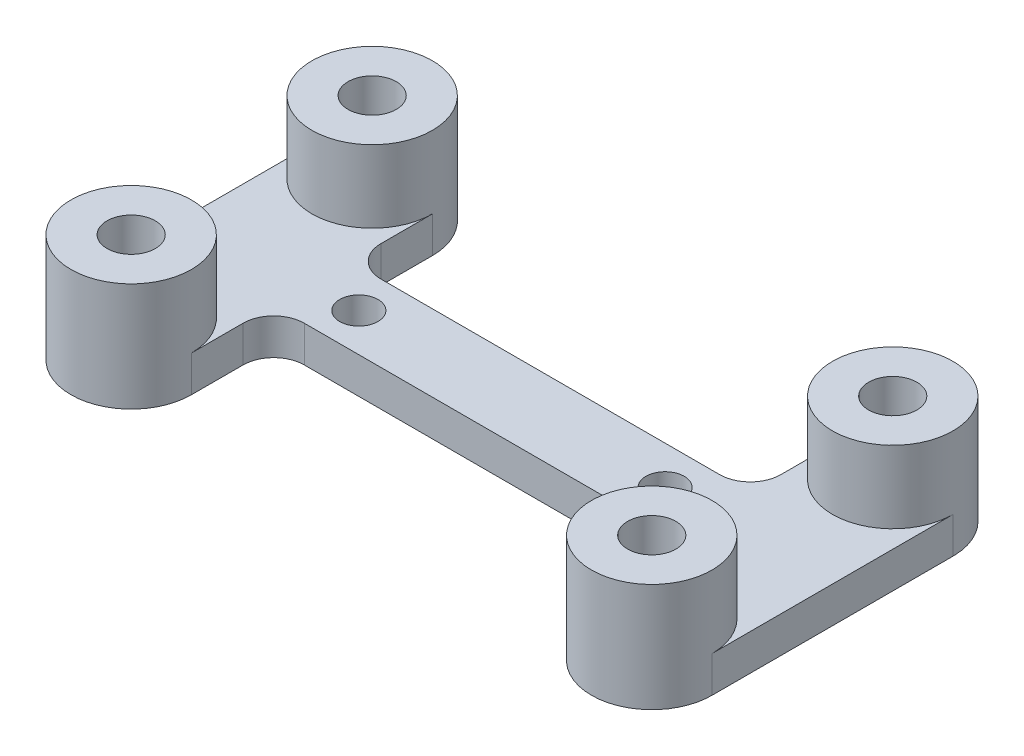
ISO-10303-21;
HEADER;
FILE_DESCRIPTION(('STEP AP214'),'2;1');
FILE_NAME('part.step','',(''),(''),'','','');
FILE_SCHEMA(('AUTOMOTIVE_DESIGN { 1 0 10303 214 1 1 1 1 }'));
ENDSEC;
DATA;
#1=APPLICATION_CONTEXT('core data for automotive mechanical design processes');
#2=APPLICATION_PROTOCOL_DEFINITION('international standard','automotive_design',2000,#1);
#3=PRODUCT_CONTEXT('',#1,'mechanical');
#4=PRODUCT('Part','Part','',(#3));
#5=PRODUCT_RELATED_PRODUCT_CATEGORY('part','',(#4));
#6=PRODUCT_DEFINITION_FORMATION('','',#4);
#7=PRODUCT_DEFINITION_CONTEXT('part definition',#1,'design');
#8=PRODUCT_DEFINITION('design','',#6,#7);
#9=PRODUCT_DEFINITION_SHAPE('','',#8);
#10=(LENGTH_UNIT() NAMED_UNIT(*) SI_UNIT(.MILLI.,.METRE.));
#11=(NAMED_UNIT(*) PLANE_ANGLE_UNIT() SI_UNIT($,.RADIAN.));
#12=(NAMED_UNIT(*) SI_UNIT($,.STERADIAN.) SOLID_ANGLE_UNIT());
#13=UNCERTAINTY_MEASURE_WITH_UNIT(LENGTH_MEASURE(1.E-05),#10,'distance_accuracy_value','');
#14=(GEOMETRIC_REPRESENTATION_CONTEXT(3) GLOBAL_UNCERTAINTY_ASSIGNED_CONTEXT((#13)) GLOBAL_UNIT_ASSIGNED_CONTEXT((#10,
#11,#12)) REPRESENTATION_CONTEXT('',''));
#15=CARTESIAN_POINT('',(0.,0.,0.));
#16=DIRECTION('',(0.,0.,1.));
#17=DIRECTION('',(1.,0.,0.));
#18=AXIS2_PLACEMENT_3D('',#15,#16,#17);
#19=CARTESIAN_POINT('',(21.59,9.,9.9949));
#20=DIRECTION('',(0.,1.,0.));
#21=DIRECTION('',(0.,0.,1.));
#22=AXIS2_PLACEMENT_3D('',#19,#20,#21);
#23=PLANE('',#22);
#24=CARTESIAN_POINT('',(21.59,9.,9.9949));
#25=DIRECTION('',(0.,1.,0.));
#26=DIRECTION('',(0.,0.,1.));
#27=AXIS2_PLACEMENT_3D('',#24,#25,#26);
#28=CIRCLE('',#27,5.);
#29=CARTESIAN_POINT('',(21.59,9.,14.9949));
#30=VERTEX_POINT('',#29);
#31=EDGE_CURVE('E65',#30,#30,#28,.T.);
#32=ORIENTED_EDGE('',*,*,#31,.T.);
#33=EDGE_LOOP('',(#32));
#34=FACE_BOUND('',#33,.T.);
#35=CARTESIAN_POINT('',(21.59,9.,9.9949));
#36=DIRECTION('',(0.,1.,0.));
#37=DIRECTION('',(0.,0.,1.));
#38=AXIS2_PLACEMENT_3D('',#35,#36,#37);
#39=CIRCLE('',#38,2.);
#40=CARTESIAN_POINT('',(21.59,9.,11.9949));
#41=VERTEX_POINT('',#40);
#42=EDGE_CURVE('E56',#41,#41,#39,.T.);
#43=ORIENTED_EDGE('',*,*,#42,.F.);
#44=EDGE_LOOP('',(#43));
#45=FACE_BOUND('',#44,.T.);
#46=ADVANCED_FACE('F52',(#34,#45),#23,.T.);
#47=CARTESIAN_POINT('',(21.59,0.,9.9949));
#48=DIRECTION('',(0.,1.,0.));
#49=DIRECTION('',(0.,0.,1.));
#50=AXIS2_PLACEMENT_3D('',#47,#48,#49);
#51=PLANE('',#50);
#52=CARTESIAN_POINT('',(21.59,0.,9.9949));
#53=DIRECTION('',(0.,1.,0.));
#54=DIRECTION('',(0.,0.,1.));
#55=AXIS2_PLACEMENT_3D('',#52,#53,#54);
#56=CIRCLE('',#55,5.);
#57=CARTESIAN_POINT('',(21.59,0.,14.9949));
#58=VERTEX_POINT('',#57);
#59=EDGE_CURVE('E63',#58,#58,#56,.T.);
#60=ORIENTED_EDGE('',*,*,#59,.F.);
#61=EDGE_LOOP('',(#60));
#62=FACE_BOUND('',#61,.T.);
#63=CARTESIAN_POINT('',(21.59,0.,9.9949));
#64=DIRECTION('',(0.,1.,0.));
#65=DIRECTION('',(0.,0.,1.));
#66=AXIS2_PLACEMENT_3D('',#63,#64,#65);
#67=CIRCLE('',#66,2.);
#68=CARTESIAN_POINT('',(21.59,0.,11.9949));
#69=VERTEX_POINT('',#68);
#70=EDGE_CURVE('E11',#69,#69,#67,.T.);
#71=ORIENTED_EDGE('',*,*,#70,.T.);
#72=EDGE_LOOP('',(#71));
#73=FACE_BOUND('',#72,.T.);
#74=ADVANCED_FACE('F73',(#62,#73),#51,.F.);
#75=CARTESIAN_POINT('',(21.59,9.,9.9949));
#76=DIRECTION('',(0.,-1.,0.));
#77=DIRECTION('',(0.,0.,-1.));
#78=AXIS2_PLACEMENT_3D('',#75,#76,#77);
#79=CYLINDRICAL_SURFACE('',#78,5.);
#80=ORIENTED_EDGE('',*,*,#31,.F.);
#81=EDGE_LOOP('',(#80));
#82=FACE_BOUND('',#81,.T.);
#83=ORIENTED_EDGE('',*,*,#59,.T.);
#84=EDGE_LOOP('',(#83));
#85=FACE_BOUND('',#84,.T.);
#86=ADVANCED_FACE('F71',(#82,#85),#79,.T.);
#87=CARTESIAN_POINT('',(21.59,9.,9.9949));
#88=DIRECTION('',(0.,-1.,0.));
#89=DIRECTION('',(0.,0.,-1.));
#90=AXIS2_PLACEMENT_3D('',#87,#88,#89);
#91=CYLINDRICAL_SURFACE('',#90,2.);
#92=ORIENTED_EDGE('',*,*,#42,.T.);
#93=EDGE_LOOP('',(#92));
#94=FACE_BOUND('',#93,.T.);
#95=ORIENTED_EDGE('',*,*,#70,.F.);
#96=EDGE_LOOP('',(#95));
#97=FACE_BOUND('',#96,.T.);
#98=ADVANCED_FACE('F54',(#94,#97),#91,.F.);
#99=CLOSED_SHELL('',(#46,#74,#86,#98));
#100=MANIFOLD_SOLID_BREP('B2',#99);
#101=CARTESIAN_POINT('',(21.59,9.,-9.9949));
#102=DIRECTION('',(0.,1.,0.));
#103=DIRECTION('',(0.,0.,1.));
#104=AXIS2_PLACEMENT_3D('',#101,#102,#103);
#105=PLANE('',#104);
#106=CARTESIAN_POINT('',(21.59,9.,-9.9949));
#107=DIRECTION('',(0.,1.,0.));
#108=DIRECTION('',(0.,0.,1.));
#109=AXIS2_PLACEMENT_3D('',#106,#107,#108);
#110=CIRCLE('',#109,5.);
#111=CARTESIAN_POINT('',(21.59,9.,-4.9949));
#112=VERTEX_POINT('',#111);
#113=EDGE_CURVE('E144',#112,#112,#110,.T.);
#114=ORIENTED_EDGE('',*,*,#113,.T.);
#115=EDGE_LOOP('',(#114));
#116=FACE_BOUND('',#115,.T.);
#117=CARTESIAN_POINT('',(21.59,9.,-9.9949));
#118=DIRECTION('',(0.,1.,0.));
#119=DIRECTION('',(0.,0.,1.));
#120=AXIS2_PLACEMENT_3D('',#117,#118,#119);
#121=CIRCLE('',#120,2.);
#122=CARTESIAN_POINT('',(21.59,9.,-7.9949));
#123=VERTEX_POINT('',#122);
#124=EDGE_CURVE('E135',#123,#123,#121,.T.);
#125=ORIENTED_EDGE('',*,*,#124,.F.);
#126=EDGE_LOOP('',(#125));
#127=FACE_BOUND('',#126,.T.);
#128=ADVANCED_FACE('F131',(#116,#127),#105,.T.);
#129=CARTESIAN_POINT('',(21.59,0.,-9.9949));
#130=DIRECTION('',(0.,1.,0.));
#131=DIRECTION('',(0.,0.,1.));
#132=AXIS2_PLACEMENT_3D('',#129,#130,#131);
#133=PLANE('',#132);
#134=CARTESIAN_POINT('',(21.59,0.,-9.9949));
#135=DIRECTION('',(0.,1.,0.));
#136=DIRECTION('',(0.,0.,1.));
#137=AXIS2_PLACEMENT_3D('',#134,#135,#136);
#138=CIRCLE('',#137,5.);
#139=CARTESIAN_POINT('',(21.59,0.,-4.9949));
#140=VERTEX_POINT('',#139);
#141=EDGE_CURVE('E142',#140,#140,#138,.T.);
#142=ORIENTED_EDGE('',*,*,#141,.F.);
#143=EDGE_LOOP('',(#142));
#144=FACE_BOUND('',#143,.T.);
#145=CARTESIAN_POINT('',(21.59,0.,-9.9949));
#146=DIRECTION('',(0.,1.,0.));
#147=DIRECTION('',(0.,0.,1.));
#148=AXIS2_PLACEMENT_3D('',#145,#146,#147);
#149=CIRCLE('',#148,2.);
#150=CARTESIAN_POINT('',(21.59,0.,-7.9949));
#151=VERTEX_POINT('',#150);
#152=EDGE_CURVE('E51',#151,#151,#149,.T.);
#153=ORIENTED_EDGE('',*,*,#152,.T.);
#154=EDGE_LOOP('',(#153));
#155=FACE_BOUND('',#154,.T.);
#156=ADVANCED_FACE('F152',(#144,#155),#133,.F.);
#157=CARTESIAN_POINT('',(21.59,9.,-9.9949));
#158=DIRECTION('',(0.,-1.,0.));
#159=DIRECTION('',(0.,0.,-1.));
#160=AXIS2_PLACEMENT_3D('',#157,#158,#159);
#161=CYLINDRICAL_SURFACE('',#160,5.);
#162=ORIENTED_EDGE('',*,*,#113,.F.);
#163=EDGE_LOOP('',(#162));
#164=FACE_BOUND('',#163,.T.);
#165=ORIENTED_EDGE('',*,*,#141,.T.);
#166=EDGE_LOOP('',(#165));
#167=FACE_BOUND('',#166,.T.);
#168=ADVANCED_FACE('F150',(#164,#167),#161,.T.);
#169=CARTESIAN_POINT('',(21.59,9.,-9.9949));
#170=DIRECTION('',(0.,-1.,0.));
#171=DIRECTION('',(0.,0.,-1.));
#172=AXIS2_PLACEMENT_3D('',#169,#170,#171);
#173=CYLINDRICAL_SURFACE('',#172,2.);
#174=ORIENTED_EDGE('',*,*,#124,.T.);
#175=EDGE_LOOP('',(#174));
#176=FACE_BOUND('',#175,.T.);
#177=ORIENTED_EDGE('',*,*,#152,.F.);
#178=EDGE_LOOP('',(#177));
#179=FACE_BOUND('',#178,.T.);
#180=ADVANCED_FACE('F133',(#176,#179),#173,.F.);
#181=CLOSED_SHELL('',(#128,#156,#168,#180));
#182=MANIFOLD_SOLID_BREP('B6',#181);
#183=CARTESIAN_POINT('',(0.,3.,0.));
#184=DIRECTION('',(0.,1.,0.));
#185=DIRECTION('',(0.,0.,1.));
#186=AXIS2_PLACEMENT_3D('',#183,#184,#185);
#187=PLANE('',#186);
#188=CARTESIAN_POINT('',(-12.7,3.,0.));
#189=DIRECTION('',(0.,1.,0.));
#190=DIRECTION('',(0.,0.,1.));
#191=AXIS2_PLACEMENT_3D('',#188,#189,#190);
#192=CIRCLE('',#191,1.5875);
#193=CARTESIAN_POINT('',(-12.7,3.,1.5875));
#194=VERTEX_POINT('',#193);
#195=EDGE_CURVE('E605',#194,#194,#192,.T.);
#196=ORIENTED_EDGE('',*,*,#195,.F.);
#197=EDGE_LOOP('',(#196));
#198=FACE_BOUND('',#197,.T.);
#199=CARTESIAN_POINT('',(12.7,3.,0.));
#200=DIRECTION('',(0.,1.,0.));
#201=DIRECTION('',(0.,0.,1.));
#202=AXIS2_PLACEMENT_3D('',#199,#200,#201);
#203=CIRCLE('',#202,1.5875);
#204=CARTESIAN_POINT('',(12.7,3.,1.5875));
#205=VERTEX_POINT('',#204);
#206=EDGE_CURVE('E609',#205,#205,#203,.T.);
#207=ORIENTED_EDGE('',*,*,#206,.F.);
#208=EDGE_LOOP('',(#207));
#209=FACE_BOUND('',#208,.T.);
#210=DIRECTION('',(0.,0.,-1.));
#211=VECTOR('',#210,1.);
#212=CARTESIAN_POINT('',(-26.59,3.,0.));
#213=LINE('',#212,#211);
#214=CARTESIAN_POINT('',(-26.59,3.,9.9949));
#215=VERTEX_POINT('',#214);
#216=CARTESIAN_POINT('',(-26.59,3.,-9.9949));
#217=VERTEX_POINT('',#216);
#218=EDGE_CURVE('E460',#215,#217,#213,.T.);
#219=ORIENTED_EDGE('',*,*,#218,.F.);
#220=CARTESIAN_POINT('',(-21.59,3.,9.9949));
#221=DIRECTION('',(0.,1.,0.));
#222=DIRECTION('',(0.,0.,1.));
#223=AXIS2_PLACEMENT_3D('',#220,#221,#222);
#224=CIRCLE('',#223,5.);
#225=CARTESIAN_POINT('',(-16.59,3.,9.9949));
#226=VERTEX_POINT('',#225);
#227=EDGE_CURVE('E442',#215,#226,#224,.F.);
#228=ORIENTED_EDGE('',*,*,#227,.T.);
#229=DIRECTION('',(0.,0.,-1.));
#230=VECTOR('',#229,1.);
#231=CARTESIAN_POINT('',(-16.59,3.,0.));
#232=LINE('',#231,#230);
#233=CARTESIAN_POINT('',(-16.59,3.,5.715));
#234=VERTEX_POINT('',#233);
#235=EDGE_CURVE('E447',#226,#234,#232,.T.);
#236=ORIENTED_EDGE('',*,*,#235,.T.);
#237=CARTESIAN_POINT('',(-14.05,3.,5.715));
#238=DIRECTION('',(0.,1.,0.));
#239=DIRECTION('',(0.,0.,1.));
#240=AXIS2_PLACEMENT_3D('',#237,#238,#239);
#241=CIRCLE('',#240,2.54);
#242=CARTESIAN_POINT('',(-14.05,3.,3.175));
#243=VERTEX_POINT('',#242);
#244=EDGE_CURVE('E129',#234,#243,#241,.F.);
#245=ORIENTED_EDGE('',*,*,#244,.T.);
#246=DIRECTION('',(-1.,0.,0.));
#247=VECTOR('',#246,1.);
#248=CARTESIAN_POINT('',(0.,3.,3.175));
#249=LINE('',#248,#247);
#250=CARTESIAN_POINT('',(14.05,3.,3.175));
#251=VERTEX_POINT('',#250);
#252=EDGE_CURVE('E450',#251,#243,#249,.T.);
#253=ORIENTED_EDGE('',*,*,#252,.F.);
#254=CARTESIAN_POINT('',(14.05,3.,5.715));
#255=DIRECTION('',(0.,1.,0.));
#256=DIRECTION('',(0.,0.,1.));
#257=AXIS2_PLACEMENT_3D('',#254,#255,#256);
#258=CIRCLE('',#257,2.54);
#259=CARTESIAN_POINT('',(16.59,3.,5.715));
#260=VERTEX_POINT('',#259);
#261=EDGE_CURVE('E544',#251,#260,#258,.F.);
#262=ORIENTED_EDGE('',*,*,#261,.T.);
#263=DIRECTION('',(0.,0.,-1.));
#264=VECTOR('',#263,1.);
#265=CARTESIAN_POINT('',(16.59,3.,0.));
#266=LINE('',#265,#264);
#267=CARTESIAN_POINT('',(16.59,3.,9.9949));
#268=VERTEX_POINT('',#267);
#269=EDGE_CURVE('E374',#268,#260,#266,.T.);
#270=ORIENTED_EDGE('',*,*,#269,.F.);
#271=DIRECTION('',(-1.,0.,0.));
#272=VECTOR('',#271,1.);
#273=CARTESIAN_POINT('',(0.,3.,9.9949));
#274=LINE('',#273,#272);
#275=CARTESIAN_POINT('',(19.59,3.,9.9949));
#276=VERTEX_POINT('',#275);
#277=EDGE_CURVE('E347',#276,#268,#274,.T.);
#278=ORIENTED_EDGE('',*,*,#277,.F.);
#279=CARTESIAN_POINT('',(21.59,3.,9.9949));
#280=DIRECTION('',(0.,-1.,0.));
#281=DIRECTION('',(0.,0.,1.));
#282=AXIS2_PLACEMENT_3D('',#279,#280,#281);
#283=CIRCLE('',#282,2.00000000000001);
#284=CARTESIAN_POINT('',(23.59,3.,9.9949));
#285=VERTEX_POINT('',#284);
#286=EDGE_CURVE('E340',#276,#285,#283,.T.);
#287=ORIENTED_EDGE('',*,*,#286,.T.);
#288=CARTESIAN_POINT('',(26.59,3.,9.9949));
#289=VERTEX_POINT('',#288);
#290=EDGE_CURVE('E344',#289,#285,#274,.T.);
#291=ORIENTED_EDGE('',*,*,#290,.F.);
#292=DIRECTION('',(0.,0.,-1.));
#293=VECTOR('',#292,1.);
#294=CARTESIAN_POINT('',(26.59,3.,0.));
#295=LINE('',#294,#293);
#296=CARTESIAN_POINT('',(26.59,3.,-9.9949));
#297=VERTEX_POINT('',#296);
#298=EDGE_CURVE('E367',#289,#297,#295,.T.);
#299=ORIENTED_EDGE('',*,*,#298,.T.);
#300=DIRECTION('',(-1.,0.,0.));
#301=VECTOR('',#300,1.);
#302=CARTESIAN_POINT('',(0.,3.,-9.9949));
#303=LINE('',#302,#301);
#304=CARTESIAN_POINT('',(23.59,3.,-9.9949));
#305=VERTEX_POINT('',#304);
#306=EDGE_CURVE('E370',#297,#305,#303,.T.);
#307=ORIENTED_EDGE('',*,*,#306,.T.);
#308=CARTESIAN_POINT('',(21.59,3.,-9.9949));
#309=DIRECTION('',(0.,-1.,0.));
#310=DIRECTION('',(0.,0.,1.));
#311=AXIS2_PLACEMENT_3D('',#308,#309,#310);
#312=CIRCLE('',#311,2.00000000000001);
#313=CARTESIAN_POINT('',(19.59,3.,-9.9949));
#314=VERTEX_POINT('',#313);
#315=EDGE_CURVE('E390',#305,#314,#312,.T.);
#316=ORIENTED_EDGE('',*,*,#315,.T.);
#317=CARTESIAN_POINT('',(16.59,3.,-9.9949));
#318=VERTEX_POINT('',#317);
#319=EDGE_CURVE('E387',#314,#318,#303,.T.);
#320=ORIENTED_EDGE('',*,*,#319,.T.);
#321=CARTESIAN_POINT('',(16.59,3.,-5.715));
#322=VERTEX_POINT('',#321);
#323=EDGE_CURVE('E381',#322,#318,#266,.T.);
#324=ORIENTED_EDGE('',*,*,#323,.F.);
#325=CARTESIAN_POINT('',(14.05,3.,-5.715));
#326=DIRECTION('',(0.,1.,0.));
#327=DIRECTION('',(0.,0.,1.));
#328=AXIS2_PLACEMENT_3D('',#325,#326,#327);
#329=CIRCLE('',#328,2.54);
#330=CARTESIAN_POINT('',(14.05,3.,-3.175));
#331=VERTEX_POINT('',#330);
#332=EDGE_CURVE('E550',#322,#331,#329,.F.);
#333=ORIENTED_EDGE('',*,*,#332,.T.);
#334=DIRECTION('',(-1.,0.,0.));
#335=VECTOR('',#334,1.);
#336=CARTESIAN_POINT('',(0.,3.,-3.175));
#337=LINE('',#336,#335);
#338=CARTESIAN_POINT('',(-14.05,3.,-3.175));
#339=VERTEX_POINT('',#338);
#340=EDGE_CURVE('E456',#331,#339,#337,.T.);
#341=ORIENTED_EDGE('',*,*,#340,.T.);
#342=CARTESIAN_POINT('',(-14.05,3.,-5.715));
#343=DIRECTION('',(0.,1.,0.));
#344=DIRECTION('',(0.,0.,1.));
#345=AXIS2_PLACEMENT_3D('',#342,#343,#344);
#346=CIRCLE('',#345,2.54);
#347=CARTESIAN_POINT('',(-16.59,3.,-5.715));
#348=VERTEX_POINT('',#347);
#349=EDGE_CURVE('E556',#339,#348,#346,.F.);
#350=ORIENTED_EDGE('',*,*,#349,.T.);
#351=CARTESIAN_POINT('',(-16.59,3.,-9.9949));
#352=VERTEX_POINT('',#351);
#353=EDGE_CURVE('E452',#348,#352,#232,.T.);
#354=ORIENTED_EDGE('',*,*,#353,.T.);
#355=CARTESIAN_POINT('',(-21.59,3.,-9.9949));
#356=DIRECTION('',(0.,1.,0.));
#357=DIRECTION('',(0.,0.,1.));
#358=AXIS2_PLACEMENT_3D('',#355,#356,#357);
#359=CIRCLE('',#358,5.);
#360=EDGE_CURVE('E496',#217,#352,#359,.T.);
#361=ORIENTED_EDGE('',*,*,#360,.F.);
#362=EDGE_LOOP('',(#219,#228,#236,#245,#253,#262,#270,#278,#287,#291,#299,#307,#316,#320,#324,
#333,#341,#350,#354,#361));
#363=FACE_BOUND('',#362,.T.);
#364=ADVANCED_FACE('F201',(#198,#209,#363),#187,.T.);
#365=CARTESIAN_POINT('',(-21.59,9.,-9.9949));
#366=DIRECTION('',(0.,1.,0.));
#367=DIRECTION('',(0.,0.,1.));
#368=AXIS2_PLACEMENT_3D('',#365,#366,#367);
#369=PLANE('',#368);
#370=CARTESIAN_POINT('',(-21.59,9.,-9.9949));
#371=DIRECTION('',(0.,1.,0.));
#372=DIRECTION('',(0.,0.,1.));
#373=AXIS2_PLACEMENT_3D('',#370,#371,#372);
#374=CIRCLE('',#373,5.);
#375=CARTESIAN_POINT('',(-21.59,9.,-4.9949));
#376=VERTEX_POINT('',#375);
#377=EDGE_CURVE('E509',#376,#376,#374,.T.);
#378=ORIENTED_EDGE('',*,*,#377,.T.);
#379=EDGE_LOOP('',(#378));
#380=FACE_BOUND('',#379,.T.);
#381=CARTESIAN_POINT('',(-21.59,9.,-9.9949));
#382=DIRECTION('',(0.,1.,0.));
#383=DIRECTION('',(0.,0.,1.));
#384=AXIS2_PLACEMENT_3D('',#381,#382,#383);
#385=CIRCLE('',#384,2.);
#386=CARTESIAN_POINT('',(-21.59,9.,-7.9949));
#387=VERTEX_POINT('',#386);
#388=EDGE_CURVE('E501',#387,#387,#385,.T.);
#389=ORIENTED_EDGE('',*,*,#388,.F.);
#390=EDGE_LOOP('',(#389));
#391=FACE_BOUND('',#390,.T.);
#392=ADVANCED_FACE('F629',(#380,#391),#369,.T.);
#393=CARTESIAN_POINT('',(-21.59,0.,-9.9949));
#394=DIRECTION('',(0.,1.,0.));
#395=DIRECTION('',(0.,0.,1.));
#396=AXIS2_PLACEMENT_3D('',#393,#394,#395);
#397=PLANE('',#396);
#398=CARTESIAN_POINT('',(-12.7,0.,0.));
#399=DIRECTION('',(0.,1.,0.));
#400=DIRECTION('',(0.,0.,1.));
#401=AXIS2_PLACEMENT_3D('',#398,#399,#400);
#402=CIRCLE('',#401,1.5875);
#403=CARTESIAN_POINT('',(-12.7,0.,1.5875));
#404=VERTEX_POINT('',#403);
#405=EDGE_CURVE('E395',#404,#404,#402,.T.);
#406=ORIENTED_EDGE('',*,*,#405,.T.);
#407=EDGE_LOOP('',(#406));
#408=FACE_BOUND('',#407,.T.);
#409=CARTESIAN_POINT('',(12.7,0.,0.));
#410=DIRECTION('',(0.,1.,0.));
#411=DIRECTION('',(0.,0.,1.));
#412=AXIS2_PLACEMENT_3D('',#409,#410,#411);
#413=CIRCLE('',#412,1.5875);
#414=CARTESIAN_POINT('',(12.7,0.,1.5875));
#415=VERTEX_POINT('',#414);
#416=EDGE_CURVE('E613',#415,#415,#413,.T.);
#417=ORIENTED_EDGE('',*,*,#416,.T.);
#418=EDGE_LOOP('',(#417));
#419=FACE_BOUND('',#418,.T.);
#420=CARTESIAN_POINT('',(-21.59,0.,9.9949));
#421=DIRECTION('',(0.,1.,0.));
#422=DIRECTION('',(0.,0.,1.));
#423=AXIS2_PLACEMENT_3D('',#420,#421,#422);
#424=CIRCLE('',#423,5.);
#425=CARTESIAN_POINT('',(-26.59,0.,9.9949));
#426=VERTEX_POINT('',#425);
#427=CARTESIAN_POINT('',(-16.59,0.,9.9949));
#428=VERTEX_POINT('',#427);
#429=EDGE_CURVE('E432',#426,#428,#424,.T.);
#430=ORIENTED_EDGE('',*,*,#429,.F.);
#431=DIRECTION('',(0.,0.,-1.));
#432=VECTOR('',#431,1.);
#433=CARTESIAN_POINT('',(-26.59,0.,0.));
#434=LINE('',#433,#432);
#435=CARTESIAN_POINT('',(-26.59,0.,-9.9949));
#436=VERTEX_POINT('',#435);
#437=EDGE_CURVE('E451',#426,#436,#434,.T.);
#438=ORIENTED_EDGE('',*,*,#437,.T.);
#439=CARTESIAN_POINT('',(-21.59,0.,-9.9949));
#440=DIRECTION('',(0.,1.,0.));
#441=DIRECTION('',(0.,0.,1.));
#442=AXIS2_PLACEMENT_3D('',#439,#440,#441);
#443=CIRCLE('',#442,5.);
#444=CARTESIAN_POINT('',(-16.59,0.,-9.9949));
#445=VERTEX_POINT('',#444);
#446=EDGE_CURVE('E505',#445,#436,#443,.T.);
#447=ORIENTED_EDGE('',*,*,#446,.F.);
#448=DIRECTION('',(0.,0.,-1.));
#449=VECTOR('',#448,1.);
#450=CARTESIAN_POINT('',(-16.59,0.,0.));
#451=LINE('',#450,#449);
#452=CARTESIAN_POINT('',(-16.59,0.,-5.715));
#453=VERTEX_POINT('',#452);
#454=EDGE_CURVE('E472',#453,#445,#451,.T.);
#455=ORIENTED_EDGE('',*,*,#454,.F.);
#456=CARTESIAN_POINT('',(-14.05,0.,-5.715));
#457=DIRECTION('',(0.,1.,0.));
#458=DIRECTION('',(0.,0.,1.));
#459=AXIS2_PLACEMENT_3D('',#456,#457,#458);
#460=CIRCLE('',#459,2.54);
#461=CARTESIAN_POINT('',(-14.05,0.,-3.175));
#462=VERTEX_POINT('',#461);
#463=EDGE_CURVE('E553',#453,#462,#460,.T.);
#464=ORIENTED_EDGE('',*,*,#463,.T.);
#465=DIRECTION('',(-1.,0.,0.));
#466=VECTOR('',#465,1.);
#467=CARTESIAN_POINT('',(0.,0.,-3.175));
#468=LINE('',#467,#466);
#469=CARTESIAN_POINT('',(14.05,0.,-3.175));
#470=VERTEX_POINT('',#469);
#471=EDGE_CURVE('E475',#470,#462,#468,.T.);
#472=ORIENTED_EDGE('',*,*,#471,.F.);
#473=CARTESIAN_POINT('',(14.05,0.,-5.715));
#474=DIRECTION('',(0.,1.,0.));
#475=DIRECTION('',(0.,0.,1.));
#476=AXIS2_PLACEMENT_3D('',#473,#474,#475);
#477=CIRCLE('',#476,2.54);
#478=CARTESIAN_POINT('',(16.59,0.,-5.715));
#479=VERTEX_POINT('',#478);
#480=EDGE_CURVE('E547',#470,#479,#477,.T.);
#481=ORIENTED_EDGE('',*,*,#480,.T.);
#482=DIRECTION('',(0.,0.,-1.));
#483=VECTOR('',#482,1.);
#484=CARTESIAN_POINT('',(16.59,0.,0.));
#485=LINE('',#484,#483);
#486=CARTESIAN_POINT('',(16.59,0.,-9.9949));
#487=VERTEX_POINT('',#486);
#488=EDGE_CURVE('E408',#479,#487,#485,.T.);
#489=ORIENTED_EDGE('',*,*,#488,.T.);
#490=DIRECTION('',(-1.,0.,0.));
#491=VECTOR('',#490,1.);
#492=CARTESIAN_POINT('',(0.,0.,-9.9949));
#493=LINE('',#492,#491);
#494=CARTESIAN_POINT('',(19.59,0.,-9.9949));
#495=VERTEX_POINT('',#494);
#496=EDGE_CURVE('E405',#495,#487,#493,.T.);
#497=ORIENTED_EDGE('',*,*,#496,.F.);
#498=CARTESIAN_POINT('',(21.59,0.,-9.9949));
#499=DIRECTION('',(0.,-1.,0.));
#500=DIRECTION('',(0.,0.,1.));
#501=AXIS2_PLACEMENT_3D('',#498,#499,#500);
#502=CIRCLE('',#501,2.00000000000001);
#503=CARTESIAN_POINT('',(23.59,0.,-9.9949));
#504=VERTEX_POINT('',#503);
#505=EDGE_CURVE('E404',#504,#495,#502,.T.);
#506=ORIENTED_EDGE('',*,*,#505,.F.);
#507=CARTESIAN_POINT('',(26.59,0.,-9.9949));
#508=VERTEX_POINT('',#507);
#509=EDGE_CURVE('E401',#508,#504,#493,.T.);
#510=ORIENTED_EDGE('',*,*,#509,.F.);
#511=DIRECTION('',(0.,0.,-1.));
#512=VECTOR('',#511,1.);
#513=CARTESIAN_POINT('',(26.59,0.,0.));
#514=LINE('',#513,#512);
#515=CARTESIAN_POINT('',(26.59,0.,9.9949));
#516=VERTEX_POINT('',#515);
#517=EDGE_CURVE('E398',#516,#508,#514,.T.);
#518=ORIENTED_EDGE('',*,*,#517,.F.);
#519=DIRECTION('',(-1.,0.,0.));
#520=VECTOR('',#519,1.);
#521=CARTESIAN_POINT('',(0.,0.,9.9949));
#522=LINE('',#521,#520);
#523=CARTESIAN_POINT('',(23.59,0.,9.9949));
#524=VERTEX_POINT('',#523);
#525=EDGE_CURVE('E394',#516,#524,#522,.T.);
#526=ORIENTED_EDGE('',*,*,#525,.T.);
#527=CARTESIAN_POINT('',(21.59,0.,9.9949));
#528=DIRECTION('',(0.,-1.,0.));
#529=DIRECTION('',(0.,0.,1.));
#530=AXIS2_PLACEMENT_3D('',#527,#528,#529);
#531=CIRCLE('',#530,2.00000000000001);
#532=CARTESIAN_POINT('',(19.59,0.,9.9949));
#533=VERTEX_POINT('',#532);
#534=EDGE_CURVE('E356',#533,#524,#531,.T.);
#535=ORIENTED_EDGE('',*,*,#534,.F.);
#536=CARTESIAN_POINT('',(16.59,0.,9.9949));
#537=VERTEX_POINT('',#536);
#538=EDGE_CURVE('E350',#533,#537,#522,.T.);
#539=ORIENTED_EDGE('',*,*,#538,.T.);
#540=CARTESIAN_POINT('',(16.59,0.,5.715));
#541=VERTEX_POINT('',#540);
#542=EDGE_CURVE('E410',#537,#541,#485,.T.);
#543=ORIENTED_EDGE('',*,*,#542,.T.);
#544=CARTESIAN_POINT('',(14.05,0.,5.715));
#545=DIRECTION('',(0.,1.,0.));
#546=DIRECTION('',(0.,0.,1.));
#547=AXIS2_PLACEMENT_3D('',#544,#545,#546);
#548=CIRCLE('',#547,2.54);
#549=CARTESIAN_POINT('',(14.05,0.,3.175));
#550=VERTEX_POINT('',#549);
#551=EDGE_CURVE('E541',#541,#550,#548,.T.);
#552=ORIENTED_EDGE('',*,*,#551,.T.);
#553=DIRECTION('',(-1.,0.,0.));
#554=VECTOR('',#553,1.);
#555=CARTESIAN_POINT('',(0.,0.,3.175));
#556=LINE('',#555,#554);
#557=CARTESIAN_POINT('',(-14.05,0.,3.175));
#558=VERTEX_POINT('',#557);
#559=EDGE_CURVE('E471',#550,#558,#556,.T.);
#560=ORIENTED_EDGE('',*,*,#559,.T.);
#561=CARTESIAN_POINT('',(-14.05,0.,5.715));
#562=DIRECTION('',(0.,1.,0.));
#563=DIRECTION('',(0.,0.,1.));
#564=AXIS2_PLACEMENT_3D('',#561,#562,#563);
#565=CIRCLE('',#564,2.54);
#566=CARTESIAN_POINT('',(-16.59,0.,5.715));
#567=VERTEX_POINT('',#566);
#568=EDGE_CURVE('E210',#558,#567,#565,.T.);
#569=ORIENTED_EDGE('',*,*,#568,.T.);
#570=EDGE_CURVE('E468',#428,#567,#451,.T.);
#571=ORIENTED_EDGE('',*,*,#570,.F.);
#572=EDGE_LOOP('',(#430,#438,#447,#455,#464,#472,#481,#489,#497,#506,#510,#518,#526,#535,#539,
#543,#552,#560,#569,#571));
#573=FACE_BOUND('',#572,.T.);
#574=CARTESIAN_POINT('',(-21.59,0.,9.9949));
#575=DIRECTION('',(0.,1.,0.));
#576=DIRECTION('',(0.,0.,1.));
#577=AXIS2_PLACEMENT_3D('',#574,#575,#576);
#578=CIRCLE('',#577,2.00000000000001);
#579=CARTESIAN_POINT('',(-21.59,0.,11.9949));
#580=VERTEX_POINT('',#579);
#581=EDGE_CURVE('E446',#580,#580,#578,.T.);
#582=ORIENTED_EDGE('',*,*,#581,.T.);
#583=EDGE_LOOP('',(#582));
#584=FACE_BOUND('',#583,.T.);
#585=CARTESIAN_POINT('',(-21.59,0.,-9.9949));
#586=DIRECTION('',(0.,1.,0.));
#587=DIRECTION('',(0.,0.,1.));
#588=AXIS2_PLACEMENT_3D('',#585,#586,#587);
#589=CIRCLE('',#588,2.);
#590=CARTESIAN_POINT('',(-21.59,0.,-7.9949));
#591=VERTEX_POINT('',#590);
#592=EDGE_CURVE('E500',#591,#591,#589,.T.);
#593=ORIENTED_EDGE('',*,*,#592,.T.);
#594=EDGE_LOOP('',(#593));
#595=FACE_BOUND('',#594,.T.);
#596=ADVANCED_FACE('F569',(#408,#419,#573,#584,#595),#397,.F.);
#597=CARTESIAN_POINT('',(-21.59,9.,-9.9949));
#598=DIRECTION('',(0.,-1.,0.));
#599=DIRECTION('',(0.,0.,-1.));
#600=AXIS2_PLACEMENT_3D('',#597,#598,#599);
#601=CYLINDRICAL_SURFACE('',#600,5.);
#602=ORIENTED_EDGE('',*,*,#360,.T.);
#603=DIRECTION('',(0.,-1.,0.));
#604=VECTOR('',#603,1.);
#605=CARTESIAN_POINT('',(-16.59,3.,-9.9949));
#606=LINE('',#605,#604);
#607=EDGE_CURVE('E488',#352,#445,#606,.T.);
#608=ORIENTED_EDGE('',*,*,#607,.T.);
#609=ORIENTED_EDGE('',*,*,#446,.T.);
#610=DIRECTION('',(0.,-1.,0.));
#611=VECTOR('',#610,1.);
#612=CARTESIAN_POINT('',(-26.59,3.,-9.9949));
#613=LINE('',#612,#611);
#614=EDGE_CURVE('E484',#217,#436,#613,.T.);
#615=ORIENTED_EDGE('',*,*,#614,.F.);
#616=EDGE_LOOP('',(#602,#608,#609,#615));
#617=FACE_BOUND('',#616,.T.);
#618=ORIENTED_EDGE('',*,*,#377,.F.);
#619=EDGE_LOOP('',(#618));
#620=FACE_BOUND('',#619,.T.);
#621=ADVANCED_FACE('F573',(#617,#620),#601,.T.);
#622=CARTESIAN_POINT('',(-21.59,9.,-9.9949));
#623=DIRECTION('',(0.,-1.,0.));
#624=DIRECTION('',(0.,0.,-1.));
#625=AXIS2_PLACEMENT_3D('',#622,#623,#624);
#626=CYLINDRICAL_SURFACE('',#625,2.);
#627=ORIENTED_EDGE('',*,*,#592,.F.);
#628=EDGE_LOOP('',(#627));
#629=FACE_BOUND('',#628,.T.);
#630=ORIENTED_EDGE('',*,*,#388,.T.);
#631=EDGE_LOOP('',(#630));
#632=FACE_BOUND('',#631,.T.);
#633=ADVANCED_FACE('F655',(#629,#632),#626,.F.);
#634=CARTESIAN_POINT('',(-21.59,3.,9.9949));
#635=DIRECTION('',(0.,-1.,0.));
#636=DIRECTION('',(0.,0.,-1.));
#637=AXIS2_PLACEMENT_3D('',#634,#635,#636);
#638=CYLINDRICAL_SURFACE('',#637,2.00000000000001);
#639=ORIENTED_EDGE('',*,*,#581,.F.);
#640=EDGE_LOOP('',(#639));
#641=FACE_BOUND('',#640,.T.);
#642=CARTESIAN_POINT('',(-21.59,9.,9.9949));
#643=DIRECTION('',(0.,1.,0.));
#644=DIRECTION('',(0.,0.,1.));
#645=AXIS2_PLACEMENT_3D('',#642,#643,#644);
#646=CIRCLE('',#645,2.);
#647=CARTESIAN_POINT('',(-21.59,9.,11.9949));
#648=VERTEX_POINT('',#647);
#649=EDGE_CURVE('E435',#648,#648,#646,.T.);
#650=ORIENTED_EDGE('',*,*,#649,.T.);
#651=EDGE_LOOP('',(#650));
#652=FACE_BOUND('',#651,.T.);
#653=ADVANCED_FACE('F652',(#641,#652),#638,.F.);
#654=CARTESIAN_POINT('',(-16.59,3.,0.));
#655=DIRECTION('',(-1.,0.,0.));
#656=DIRECTION('',(0.,0.,1.));
#657=AXIS2_PLACEMENT_3D('',#654,#655,#656);
#658=PLANE('',#657);
#659=ORIENTED_EDGE('',*,*,#570,.T.);
#660=DIRECTION('',(0.,-1.,0.));
#661=VECTOR('',#660,1.);
#662=CARTESIAN_POINT('',(-16.59,3.,5.715));
#663=LINE('',#662,#661);
#664=EDGE_CURVE('E217',#567,#234,#663,.F.);
#665=ORIENTED_EDGE('',*,*,#664,.T.);
#666=ORIENTED_EDGE('',*,*,#235,.F.);
#667=DIRECTION('',(0.,-1.,0.));
#668=VECTOR('',#667,1.);
#669=CARTESIAN_POINT('',(-16.59,3.,9.9949));
#670=LINE('',#669,#668);
#671=EDGE_CURVE('E492',#226,#428,#670,.T.);
#672=ORIENTED_EDGE('',*,*,#671,.T.);
#673=EDGE_LOOP('',(#659,#665,#666,#672));
#674=FACE_BOUND('',#673,.T.);
#675=ADVANCED_FACE('F581',(#674),#658,.F.);
#676=CARTESIAN_POINT('',(0.,3.,3.175));
#677=DIRECTION('',(0.,0.,1.));
#678=DIRECTION('',(1.,0.,0.));
#679=AXIS2_PLACEMENT_3D('',#676,#677,#678);
#680=PLANE('',#679);
#681=ORIENTED_EDGE('',*,*,#559,.F.);
#682=DIRECTION('',(0.,-1.,0.));
#683=VECTOR('',#682,1.);
#684=CARTESIAN_POINT('',(14.05,3.,3.175));
#685=LINE('',#684,#683);
#686=EDGE_CURVE('E522',#550,#251,#685,.F.);
#687=ORIENTED_EDGE('',*,*,#686,.T.);
#688=ORIENTED_EDGE('',*,*,#252,.T.);
#689=DIRECTION('',(0.,-1.,0.));
#690=VECTOR('',#689,1.);
#691=CARTESIAN_POINT('',(-14.05,3.,3.175));
#692=LINE('',#691,#690);
#693=EDGE_CURVE('E518',#243,#558,#692,.T.);
#694=ORIENTED_EDGE('',*,*,#693,.T.);
#695=EDGE_LOOP('',(#681,#687,#688,#694));
#696=FACE_BOUND('',#695,.T.);
#697=ADVANCED_FACE('F589',(#696),#680,.T.);
#698=CARTESIAN_POINT('',(0.,3.,-3.175));
#699=DIRECTION('',(0.,0.,1.));
#700=DIRECTION('',(1.,0.,0.));
#701=AXIS2_PLACEMENT_3D('',#698,#699,#700);
#702=PLANE('',#701);
#703=ORIENTED_EDGE('',*,*,#340,.F.);
#704=DIRECTION('',(0.,-1.,0.));
#705=VECTOR('',#704,1.);
#706=CARTESIAN_POINT('',(14.05,3.,-3.175));
#707=LINE('',#706,#705);
#708=EDGE_CURVE('E528',#331,#470,#707,.T.);
#709=ORIENTED_EDGE('',*,*,#708,.T.);
#710=ORIENTED_EDGE('',*,*,#471,.T.);
#711=DIRECTION('',(0.,-1.,0.));
#712=VECTOR('',#711,1.);
#713=CARTESIAN_POINT('',(-14.05,3.,-3.175));
#714=LINE('',#713,#712);
#715=EDGE_CURVE('E525',#462,#339,#714,.F.);
#716=ORIENTED_EDGE('',*,*,#715,.T.);
#717=EDGE_LOOP('',(#703,#709,#710,#716));
#718=FACE_BOUND('',#717,.T.);
#719=ADVANCED_FACE('F646',(#718),#702,.F.);
#720=ORIENTED_EDGE('',*,*,#353,.F.);
#721=DIRECTION('',(0.,-1.,0.));
#722=VECTOR('',#721,1.);
#723=CARTESIAN_POINT('',(-16.59,0.,-5.715));
#724=LINE('',#723,#722);
#725=EDGE_CURVE('E535',#348,#453,#724,.T.);
#726=ORIENTED_EDGE('',*,*,#725,.T.);
#727=ORIENTED_EDGE('',*,*,#454,.T.);
#728=ORIENTED_EDGE('',*,*,#607,.F.);
#729=EDGE_LOOP('',(#720,#726,#727,#728));
#730=FACE_BOUND('',#729,.T.);
#731=ADVANCED_FACE('F566',(#730),#658,.F.);
#732=CARTESIAN_POINT('',(-26.59,3.,0.));
#733=DIRECTION('',(-1.,0.,0.));
#734=DIRECTION('',(0.,0.,1.));
#735=AXIS2_PLACEMENT_3D('',#732,#733,#734);
#736=PLANE('',#735);
#737=ORIENTED_EDGE('',*,*,#437,.F.);
#738=DIRECTION('',(0.,-1.,0.));
#739=VECTOR('',#738,1.);
#740=CARTESIAN_POINT('',(-26.59,3.,9.9949));
#741=LINE('',#740,#739);
#742=EDGE_CURVE('E464',#215,#426,#741,.T.);
#743=ORIENTED_EDGE('',*,*,#742,.F.);
#744=ORIENTED_EDGE('',*,*,#218,.T.);
#745=ORIENTED_EDGE('',*,*,#614,.T.);
#746=EDGE_LOOP('',(#737,#743,#744,#745));
#747=FACE_BOUND('',#746,.T.);
#748=ADVANCED_FACE('F578',(#747),#736,.T.);
#749=CARTESIAN_POINT('',(-21.59,9.,9.9949));
#750=DIRECTION('',(0.,-1.,0.));
#751=DIRECTION('',(0.,0.,-1.));
#752=AXIS2_PLACEMENT_3D('',#749,#750,#751);
#753=CYLINDRICAL_SURFACE('',#752,5.);
#754=CARTESIAN_POINT('',(-21.59,9.,9.9949));
#755=DIRECTION('',(0.,1.,0.));
#756=DIRECTION('',(0.,0.,1.));
#757=AXIS2_PLACEMENT_3D('',#754,#755,#756);
#758=CIRCLE('',#757,5.);
#759=CARTESIAN_POINT('',(-21.59,9.,14.9949));
#760=VERTEX_POINT('',#759);
#761=EDGE_CURVE('E361',#760,#760,#758,.T.);
#762=ORIENTED_EDGE('',*,*,#761,.F.);
#763=EDGE_LOOP('',(#762));
#764=FACE_BOUND('',#763,.T.);
#765=ORIENTED_EDGE('',*,*,#429,.T.);
#766=ORIENTED_EDGE('',*,*,#671,.F.);
#767=ORIENTED_EDGE('',*,*,#227,.F.);
#768=ORIENTED_EDGE('',*,*,#742,.T.);
#769=EDGE_LOOP('',(#765,#766,#767,#768));
#770=FACE_BOUND('',#769,.T.);
#771=ADVANCED_FACE('F580',(#764,#770),#753,.T.);
#772=CARTESIAN_POINT('',(-21.59,9.,9.9949));
#773=DIRECTION('',(0.,1.,0.));
#774=DIRECTION('',(0.,0.,1.));
#775=AXIS2_PLACEMENT_3D('',#772,#773,#774);
#776=PLANE('',#775);
#777=ORIENTED_EDGE('',*,*,#761,.T.);
#778=EDGE_LOOP('',(#777));
#779=FACE_BOUND('',#778,.T.);
#780=ORIENTED_EDGE('',*,*,#649,.F.);
#781=EDGE_LOOP('',(#780));
#782=FACE_BOUND('',#781,.T.);
#783=ADVANCED_FACE('F640',(#779,#782),#776,.T.);
#784=CARTESIAN_POINT('',(21.59,3.,9.9949));
#785=DIRECTION('',(0.,-1.,0.));
#786=DIRECTION('',(0.,0.,-1.));
#787=AXIS2_PLACEMENT_3D('',#784,#785,#786);
#788=CYLINDRICAL_SURFACE('',#787,2.00000000000001);
#789=ORIENTED_EDGE('',*,*,#534,.T.);
#790=DIRECTION('',(0.,-1.,0.));
#791=VECTOR('',#790,1.);
#792=CARTESIAN_POINT('',(23.59,3.,9.9949));
#793=LINE('',#792,#791);
#794=EDGE_CURVE('E353',#285,#524,#793,.T.);
#795=ORIENTED_EDGE('',*,*,#794,.F.);
#796=ORIENTED_EDGE('',*,*,#286,.F.);
#797=DIRECTION('',(0.,-1.,0.));
#798=VECTOR('',#797,1.);
#799=CARTESIAN_POINT('',(19.59,3.,9.9949));
#800=LINE('',#799,#798);
#801=EDGE_CURVE('E373',#276,#533,#800,.T.);
#802=ORIENTED_EDGE('',*,*,#801,.T.);
#803=EDGE_LOOP('',(#789,#795,#796,#802));
#804=FACE_BOUND('',#803,.T.);
#805=ADVANCED_FACE('F354',(#804),#788,.F.);
#806=CARTESIAN_POINT('',(0.,3.,9.9949));
#807=DIRECTION('',(0.,0.,1.));
#808=DIRECTION('',(1.,0.,0.));
#809=AXIS2_PLACEMENT_3D('',#806,#807,#808);
#810=PLANE('',#809);
#811=ORIENTED_EDGE('',*,*,#525,.F.);
#812=DIRECTION('',(0.,-1.,0.));
#813=VECTOR('',#812,1.);
#814=CARTESIAN_POINT('',(26.59,3.,9.9949));
#815=LINE('',#814,#813);
#816=EDGE_CURVE('E362',#289,#516,#815,.T.);
#817=ORIENTED_EDGE('',*,*,#816,.F.);
#818=ORIENTED_EDGE('',*,*,#290,.T.);
#819=ORIENTED_EDGE('',*,*,#794,.T.);
#820=EDGE_LOOP('',(#811,#817,#818,#819));
#821=FACE_BOUND('',#820,.T.);
#822=ADVANCED_FACE('F364',(#821),#810,.T.);
#823=CARTESIAN_POINT('',(26.59,3.,0.));
#824=DIRECTION('',(-1.,0.,0.));
#825=DIRECTION('',(0.,0.,1.));
#826=AXIS2_PLACEMENT_3D('',#823,#824,#825);
#827=PLANE('',#826);
#828=ORIENTED_EDGE('',*,*,#517,.T.);
#829=DIRECTION('',(0.,-1.,0.));
#830=VECTOR('',#829,1.);
#831=CARTESIAN_POINT('',(26.59,3.,-9.9949));
#832=LINE('',#831,#830);
#833=EDGE_CURVE('E426',#297,#508,#832,.T.);
#834=ORIENTED_EDGE('',*,*,#833,.F.);
#835=ORIENTED_EDGE('',*,*,#298,.F.);
#836=ORIENTED_EDGE('',*,*,#816,.T.);
#837=EDGE_LOOP('',(#828,#834,#835,#836));
#838=FACE_BOUND('',#837,.T.);
#839=ADVANCED_FACE('F706',(#838),#827,.F.);
#840=CARTESIAN_POINT('',(0.,3.,-9.9949));
#841=DIRECTION('',(0.,0.,1.));
#842=DIRECTION('',(1.,0.,0.));
#843=AXIS2_PLACEMENT_3D('',#840,#841,#842);
#844=PLANE('',#843);
#845=ORIENTED_EDGE('',*,*,#509,.T.);
#846=DIRECTION('',(0.,-1.,0.));
#847=VECTOR('',#846,1.);
#848=CARTESIAN_POINT('',(23.59,3.,-9.9949));
#849=LINE('',#848,#847);
#850=EDGE_CURVE('E422',#305,#504,#849,.T.);
#851=ORIENTED_EDGE('',*,*,#850,.F.);
#852=ORIENTED_EDGE('',*,*,#306,.F.);
#853=ORIENTED_EDGE('',*,*,#833,.T.);
#854=EDGE_LOOP('',(#845,#851,#852,#853));
#855=FACE_BOUND('',#854,.T.);
#856=ADVANCED_FACE('F703',(#855),#844,.F.);
#857=CARTESIAN_POINT('',(21.59,3.,-9.9949));
#858=DIRECTION('',(0.,-1.,0.));
#859=DIRECTION('',(0.,0.,-1.));
#860=AXIS2_PLACEMENT_3D('',#857,#858,#859);
#861=CYLINDRICAL_SURFACE('',#860,2.00000000000001);
#862=ORIENTED_EDGE('',*,*,#505,.T.);
#863=DIRECTION('',(0.,-1.,0.));
#864=VECTOR('',#863,1.);
#865=CARTESIAN_POINT('',(19.59,3.,-9.9949));
#866=LINE('',#865,#864);
#867=EDGE_CURVE('E418',#314,#495,#866,.T.);
#868=ORIENTED_EDGE('',*,*,#867,.F.);
#869=ORIENTED_EDGE('',*,*,#315,.F.);
#870=ORIENTED_EDGE('',*,*,#850,.T.);
#871=EDGE_LOOP('',(#862,#868,#869,#870));
#872=FACE_BOUND('',#871,.T.);
#873=ADVANCED_FACE('F698',(#872),#861,.F.);
#874=ORIENTED_EDGE('',*,*,#496,.T.);
#875=DIRECTION('',(0.,-1.,0.));
#876=VECTOR('',#875,1.);
#877=CARTESIAN_POINT('',(16.59,3.,-9.9949));
#878=LINE('',#877,#876);
#879=EDGE_CURVE('E414',#318,#487,#878,.T.);
#880=ORIENTED_EDGE('',*,*,#879,.F.);
#881=ORIENTED_EDGE('',*,*,#319,.F.);
#882=ORIENTED_EDGE('',*,*,#867,.T.);
#883=EDGE_LOOP('',(#874,#880,#881,#882));
#884=FACE_BOUND('',#883,.T.);
#885=ADVANCED_FACE('F692',(#884),#844,.F.);
#886=CARTESIAN_POINT('',(16.59,3.,0.));
#887=DIRECTION('',(-1.,0.,0.));
#888=DIRECTION('',(0.,0.,1.));
#889=AXIS2_PLACEMENT_3D('',#886,#887,#888);
#890=PLANE('',#889);
#891=ORIENTED_EDGE('',*,*,#488,.F.);
#892=DIRECTION('',(0.,-1.,0.));
#893=VECTOR('',#892,1.);
#894=CARTESIAN_POINT('',(16.59,3.,-5.715));
#895=LINE('',#894,#893);
#896=EDGE_CURVE('E532',#479,#322,#895,.F.);
#897=ORIENTED_EDGE('',*,*,#896,.T.);
#898=ORIENTED_EDGE('',*,*,#323,.T.);
#899=ORIENTED_EDGE('',*,*,#879,.T.);
#900=EDGE_LOOP('',(#891,#897,#898,#899));
#901=FACE_BOUND('',#900,.T.);
#902=ADVANCED_FACE('F687',(#901),#890,.T.);
#903=ORIENTED_EDGE('',*,*,#269,.T.);
#904=DIRECTION('',(0.,-1.,0.));
#905=VECTOR('',#904,1.);
#906=CARTESIAN_POINT('',(16.59,0.,5.715));
#907=LINE('',#906,#905);
#908=EDGE_CURVE('E513',#260,#541,#907,.T.);
#909=ORIENTED_EDGE('',*,*,#908,.T.);
#910=ORIENTED_EDGE('',*,*,#542,.F.);
#911=DIRECTION('',(0.,-1.,0.));
#912=VECTOR('',#911,1.);
#913=CARTESIAN_POINT('',(16.59,3.,9.9949));
#914=LINE('',#913,#912);
#915=EDGE_CURVE('E378',#268,#537,#914,.T.);
#916=ORIENTED_EDGE('',*,*,#915,.F.);
#917=EDGE_LOOP('',(#903,#909,#910,#916));
#918=FACE_BOUND('',#917,.T.);
#919=ADVANCED_FACE('F595',(#918),#890,.T.);
#920=ORIENTED_EDGE('',*,*,#538,.F.);
#921=ORIENTED_EDGE('',*,*,#801,.F.);
#922=ORIENTED_EDGE('',*,*,#277,.T.);
#923=ORIENTED_EDGE('',*,*,#915,.T.);
#924=EDGE_LOOP('',(#920,#921,#922,#923));
#925=FACE_BOUND('',#924,.T.);
#926=ADVANCED_FACE('F624',(#925),#810,.T.);
#927=CARTESIAN_POINT('',(12.7,0.,0.));
#928=DIRECTION('',(0.,1.,0.));
#929=DIRECTION('',(0.,0.,1.));
#930=AXIS2_PLACEMENT_3D('',#927,#928,#929);
#931=CYLINDRICAL_SURFACE('',#930,1.5875);
#932=ORIENTED_EDGE('',*,*,#416,.F.);
#933=EDGE_LOOP('',(#932));
#934=FACE_BOUND('',#933,.T.);
#935=ORIENTED_EDGE('',*,*,#206,.T.);
#936=EDGE_LOOP('',(#935));
#937=FACE_BOUND('',#936,.T.);
#938=ADVANCED_FACE('F620',(#934,#937),#931,.F.);
#939=CARTESIAN_POINT('',(-12.7,0.,0.));
#940=DIRECTION('',(0.,1.,0.));
#941=DIRECTION('',(0.,0.,1.));
#942=AXIS2_PLACEMENT_3D('',#939,#940,#941);
#943=CYLINDRICAL_SURFACE('',#942,1.5875);
#944=ORIENTED_EDGE('',*,*,#405,.F.);
#945=EDGE_LOOP('',(#944));
#946=FACE_BOUND('',#945,.T.);
#947=ORIENTED_EDGE('',*,*,#195,.T.);
#948=EDGE_LOOP('',(#947));
#949=FACE_BOUND('',#948,.T.);
#950=ADVANCED_FACE('F623',(#946,#949),#943,.F.);
#951=CARTESIAN_POINT('',(14.05,3.,5.715));
#952=DIRECTION('',(0.,1.,0.));
#953=DIRECTION('',(0.,0.,1.));
#954=AXIS2_PLACEMENT_3D('',#951,#952,#953);
#955=CYLINDRICAL_SURFACE('',#954,2.54);
#956=ORIENTED_EDGE('',*,*,#261,.F.);
#957=ORIENTED_EDGE('',*,*,#686,.F.);
#958=ORIENTED_EDGE('',*,*,#551,.F.);
#959=ORIENTED_EDGE('',*,*,#908,.F.);
#960=EDGE_LOOP('',(#956,#957,#958,#959));
#961=FACE_BOUND('',#960,.T.);
#962=ADVANCED_FACE('F592',(#961),#955,.F.);
#963=CARTESIAN_POINT('',(14.05,3.,-5.715));
#964=DIRECTION('',(0.,-1.,0.));
#965=DIRECTION('',(0.,0.,-1.));
#966=AXIS2_PLACEMENT_3D('',#963,#964,#965);
#967=CYLINDRICAL_SURFACE('',#966,2.54);
#968=ORIENTED_EDGE('',*,*,#332,.F.);
#969=ORIENTED_EDGE('',*,*,#896,.F.);
#970=ORIENTED_EDGE('',*,*,#480,.F.);
#971=ORIENTED_EDGE('',*,*,#708,.F.);
#972=EDGE_LOOP('',(#968,#969,#970,#971));
#973=FACE_BOUND('',#972,.T.);
#974=ADVANCED_FACE('F667',(#973),#967,.F.);
#975=CARTESIAN_POINT('',(-14.05,3.,-5.715));
#976=DIRECTION('',(0.,1.,0.));
#977=DIRECTION('',(0.,0.,1.));
#978=AXIS2_PLACEMENT_3D('',#975,#976,#977);
#979=CYLINDRICAL_SURFACE('',#978,2.54);
#980=ORIENTED_EDGE('',*,*,#349,.F.);
#981=ORIENTED_EDGE('',*,*,#715,.F.);
#982=ORIENTED_EDGE('',*,*,#463,.F.);
#983=ORIENTED_EDGE('',*,*,#725,.F.);
#984=EDGE_LOOP('',(#980,#981,#982,#983));
#985=FACE_BOUND('',#984,.T.);
#986=ADVANCED_FACE('F669',(#985),#979,.F.);
#987=CARTESIAN_POINT('',(-14.05,3.,5.715));
#988=DIRECTION('',(0.,-1.,0.));
#989=DIRECTION('',(0.,0.,-1.));
#990=AXIS2_PLACEMENT_3D('',#987,#988,#989);
#991=CYLINDRICAL_SURFACE('',#990,2.54);
#992=ORIENTED_EDGE('',*,*,#244,.F.);
#993=ORIENTED_EDGE('',*,*,#664,.F.);
#994=ORIENTED_EDGE('',*,*,#568,.F.);
#995=ORIENTED_EDGE('',*,*,#693,.F.);
#996=EDGE_LOOP('',(#992,#993,#994,#995));
#997=FACE_BOUND('',#996,.T.);
#998=ADVANCED_FACE('F203',(#997),#991,.F.);
#999=CLOSED_SHELL('',(#364,#392,#596,#621,#633,#653,#675,#697,#719,#731,#748,#771,#783,#805,
#822,#839,#856,#873,#885,#902,#919,#926,#938,#950,#962,#974,#986,#998));
#1000=MANIFOLD_SOLID_BREP('B46',#999);
#1001=ADVANCED_BREP_SHAPE_REPRESENTATION('',(#18,#100,#182,#1000),#14);
#1002=SHAPE_DEFINITION_REPRESENTATION(#9,#1001);
ENDSEC;
END-ISO-10303-21;
